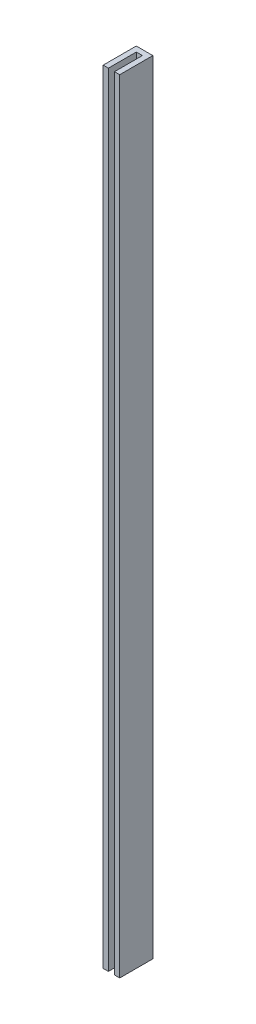
ISO-10303-21;
HEADER;
FILE_DESCRIPTION(('STEP AP214'),'2;1');
FILE_NAME('part.step','',(''),(''),'','','');
FILE_SCHEMA(('AUTOMOTIVE_DESIGN { 1 0 10303 214 1 1 1 1 }'));
ENDSEC;
DATA;
#1=APPLICATION_CONTEXT('core data for automotive mechanical design processes');
#2=APPLICATION_PROTOCOL_DEFINITION('international standard','automotive_design',2000,#1);
#3=PRODUCT_CONTEXT('',#1,'mechanical');
#4=PRODUCT('Part','Part','',(#3));
#5=PRODUCT_RELATED_PRODUCT_CATEGORY('part','',(#4));
#6=PRODUCT_DEFINITION_FORMATION('','',#4);
#7=PRODUCT_DEFINITION_CONTEXT('part definition',#1,'design');
#8=PRODUCT_DEFINITION('design','',#6,#7);
#9=PRODUCT_DEFINITION_SHAPE('','',#8);
#10=(LENGTH_UNIT() NAMED_UNIT(*) SI_UNIT(.MILLI.,.METRE.));
#11=(NAMED_UNIT(*) PLANE_ANGLE_UNIT() SI_UNIT($,.RADIAN.));
#12=(NAMED_UNIT(*) SI_UNIT($,.STERADIAN.) SOLID_ANGLE_UNIT());
#13=UNCERTAINTY_MEASURE_WITH_UNIT(LENGTH_MEASURE(1.E-05),#10,'distance_accuracy_value','');
#14=(GEOMETRIC_REPRESENTATION_CONTEXT(3) GLOBAL_UNCERTAINTY_ASSIGNED_CONTEXT((#13)) GLOBAL_UNIT_ASSIGNED_CONTEXT((#10,
#11,#12)) REPRESENTATION_CONTEXT('',''));
#15=CARTESIAN_POINT('',(0.,0.,0.));
#16=DIRECTION('',(0.,0.,1.));
#17=DIRECTION('',(1.,0.,0.));
#18=AXIS2_PLACEMENT_3D('',#15,#16,#17);
#19=CARTESIAN_POINT('',(-1.175,300.,12.7));
#20=DIRECTION('',(-1.,0.,0.));
#21=DIRECTION('',(0.,0.,1.));
#22=AXIS2_PLACEMENT_3D('',#19,#20,#21);
#23=PLANE('',#22);
#24=DIRECTION('',(0.,0.,-1.));
#25=VECTOR('',#24,1.);
#26=CARTESIAN_POINT('',(-1.175,0.,12.7));
#27=LINE('',#26,#25);
#28=CARTESIAN_POINT('',(-1.175,0.,12.7));
#29=VERTEX_POINT('',#28);
#30=CARTESIAN_POINT('',(-1.175,0.,2.));
#31=VERTEX_POINT('',#30);
#32=EDGE_CURVE('E129',#29,#31,#27,.T.);
#33=ORIENTED_EDGE('',*,*,#32,.T.);
#34=DIRECTION('',(0.,-1.,0.));
#35=VECTOR('',#34,1.);
#36=CARTESIAN_POINT('',(-1.175,300.,2.));
#37=LINE('',#36,#35);
#38=CARTESIAN_POINT('',(-1.175,300.,2.));
#39=VERTEX_POINT('',#38);
#40=EDGE_CURVE('E11',#39,#31,#37,.T.);
#41=ORIENTED_EDGE('',*,*,#40,.F.);
#42=DIRECTION('',(0.,0.,-1.));
#43=VECTOR('',#42,1.);
#44=CARTESIAN_POINT('',(-1.175,300.,12.7));
#45=LINE('',#44,#43);
#46=CARTESIAN_POINT('',(-1.175,300.,12.7));
#47=VERTEX_POINT('',#46);
#48=EDGE_CURVE('E143',#47,#39,#45,.T.);
#49=ORIENTED_EDGE('',*,*,#48,.F.);
#50=DIRECTION('',(0.,-1.,0.));
#51=VECTOR('',#50,1.);
#52=CARTESIAN_POINT('',(-1.175,300.,12.7));
#53=LINE('',#52,#51);
#54=EDGE_CURVE('E125',#47,#29,#53,.T.);
#55=ORIENTED_EDGE('',*,*,#54,.T.);
#56=EDGE_LOOP('',(#33,#41,#49,#55));
#57=FACE_BOUND('',#56,.T.);
#58=ADVANCED_FACE('F33',(#57),#23,.F.);
#59=CARTESIAN_POINT('',(-1.175,300.,2.));
#60=DIRECTION('',(0.,0.,-1.));
#61=DIRECTION('',(-1.,0.,0.));
#62=AXIS2_PLACEMENT_3D('',#59,#60,#61);
#63=PLANE('',#62);
#64=DIRECTION('',(1.,0.,0.));
#65=VECTOR('',#64,1.);
#66=CARTESIAN_POINT('',(-1.175,0.,2.));
#67=LINE('',#66,#65);
#68=CARTESIAN_POINT('',(1.175,0.,2.));
#69=VERTEX_POINT('',#68);
#70=EDGE_CURVE('E132',#31,#69,#67,.T.);
#71=ORIENTED_EDGE('',*,*,#70,.T.);
#72=DIRECTION('',(0.,-1.,0.));
#73=VECTOR('',#72,1.);
#74=CARTESIAN_POINT('',(1.175,300.,2.));
#75=LINE('',#74,#73);
#76=CARTESIAN_POINT('',(1.175,300.,2.));
#77=VERTEX_POINT('',#76);
#78=EDGE_CURVE('E41',#77,#69,#75,.T.);
#79=ORIENTED_EDGE('',*,*,#78,.F.);
#80=DIRECTION('',(1.,0.,0.));
#81=VECTOR('',#80,1.);
#82=CARTESIAN_POINT('',(-1.175,300.,2.));
#83=LINE('',#82,#81);
#84=EDGE_CURVE('E92',#39,#77,#83,.T.);
#85=ORIENTED_EDGE('',*,*,#84,.F.);
#86=ORIENTED_EDGE('',*,*,#40,.T.);
#87=EDGE_LOOP('',(#71,#79,#85,#86));
#88=FACE_BOUND('',#87,.T.);
#89=ADVANCED_FACE('F178',(#88),#63,.F.);
#90=CARTESIAN_POINT('',(1.175,300.,12.7));
#91=DIRECTION('',(1.,0.,0.));
#92=DIRECTION('',(0.,0.,-1.));
#93=AXIS2_PLACEMENT_3D('',#90,#91,#92);
#94=PLANE('',#93);
#95=DIRECTION('',(0.,0.,1.));
#96=VECTOR('',#95,1.);
#97=CARTESIAN_POINT('',(1.175,0.,12.7));
#98=LINE('',#97,#96);
#99=CARTESIAN_POINT('',(1.175,0.,12.7));
#100=VERTEX_POINT('',#99);
#101=EDGE_CURVE('E134',#69,#100,#98,.T.);
#102=ORIENTED_EDGE('',*,*,#101,.T.);
#103=DIRECTION('',(0.,-1.,0.));
#104=VECTOR('',#103,1.);
#105=CARTESIAN_POINT('',(1.175,300.,12.7));
#106=LINE('',#105,#104);
#107=CARTESIAN_POINT('',(1.175,300.,12.7));
#108=VERTEX_POINT('',#107);
#109=EDGE_CURVE('E150',#108,#100,#106,.T.);
#110=ORIENTED_EDGE('',*,*,#109,.F.);
#111=DIRECTION('',(0.,0.,1.));
#112=VECTOR('',#111,1.);
#113=CARTESIAN_POINT('',(1.175,300.,12.7));
#114=LINE('',#113,#112);
#115=EDGE_CURVE('E158',#77,#108,#114,.T.);
#116=ORIENTED_EDGE('',*,*,#115,.F.);
#117=ORIENTED_EDGE('',*,*,#78,.T.);
#118=EDGE_LOOP('',(#102,#110,#116,#117));
#119=FACE_BOUND('',#118,.T.);
#120=ADVANCED_FACE('F156',(#119),#94,.F.);
#121=CARTESIAN_POINT('',(3.175,300.,12.7));
#122=DIRECTION('',(0.,0.,-1.));
#123=DIRECTION('',(-1.,0.,0.));
#124=AXIS2_PLACEMENT_3D('',#121,#122,#123);
#125=PLANE('',#124);
#126=DIRECTION('',(1.,0.,0.));
#127=VECTOR('',#126,1.);
#128=CARTESIAN_POINT('',(3.175,0.,12.7));
#129=LINE('',#128,#127);
#130=CARTESIAN_POINT('',(3.175,0.,12.7));
#131=VERTEX_POINT('',#130);
#132=EDGE_CURVE('E136',#100,#131,#129,.T.);
#133=ORIENTED_EDGE('',*,*,#132,.T.);
#134=DIRECTION('',(0.,-1.,0.));
#135=VECTOR('',#134,1.);
#136=CARTESIAN_POINT('',(3.175,300.,12.7));
#137=LINE('',#136,#135);
#138=CARTESIAN_POINT('',(3.175,300.,12.7));
#139=VERTEX_POINT('',#138);
#140=EDGE_CURVE('E147',#139,#131,#137,.T.);
#141=ORIENTED_EDGE('',*,*,#140,.F.);
#142=DIRECTION('',(1.,0.,0.));
#143=VECTOR('',#142,1.);
#144=CARTESIAN_POINT('',(3.175,300.,12.7));
#145=LINE('',#144,#143);
#146=EDGE_CURVE('E170',#108,#139,#145,.T.);
#147=ORIENTED_EDGE('',*,*,#146,.F.);
#148=ORIENTED_EDGE('',*,*,#109,.T.);
#149=EDGE_LOOP('',(#133,#141,#147,#148));
#150=FACE_BOUND('',#149,.T.);
#151=ADVANCED_FACE('F166',(#150),#125,.F.);
#152=CARTESIAN_POINT('',(3.175,300.,0.));
#153=DIRECTION('',(-1.,0.,0.));
#154=DIRECTION('',(0.,0.,1.));
#155=AXIS2_PLACEMENT_3D('',#152,#153,#154);
#156=PLANE('',#155);
#157=DIRECTION('',(0.,0.,-1.));
#158=VECTOR('',#157,1.);
#159=CARTESIAN_POINT('',(3.175,0.,0.));
#160=LINE('',#159,#158);
#161=CARTESIAN_POINT('',(3.175,0.,0.));
#162=VERTEX_POINT('',#161);
#163=EDGE_CURVE('E138',#131,#162,#160,.T.);
#164=ORIENTED_EDGE('',*,*,#163,.T.);
#165=DIRECTION('',(0.,-1.,0.));
#166=VECTOR('',#165,1.);
#167=CARTESIAN_POINT('',(3.175,300.,0.));
#168=LINE('',#167,#166);
#169=CARTESIAN_POINT('',(3.175,300.,0.));
#170=VERTEX_POINT('',#169);
#171=EDGE_CURVE('E120',#170,#162,#168,.T.);
#172=ORIENTED_EDGE('',*,*,#171,.F.);
#173=DIRECTION('',(0.,0.,-1.));
#174=VECTOR('',#173,1.);
#175=CARTESIAN_POINT('',(3.175,300.,0.));
#176=LINE('',#175,#174);
#177=EDGE_CURVE('E111',#139,#170,#176,.T.);
#178=ORIENTED_EDGE('',*,*,#177,.F.);
#179=ORIENTED_EDGE('',*,*,#140,.T.);
#180=EDGE_LOOP('',(#164,#172,#178,#179));
#181=FACE_BOUND('',#180,.T.);
#182=ADVANCED_FACE('F169',(#181),#156,.F.);
#183=CARTESIAN_POINT('',(3.175,300.,0.));
#184=DIRECTION('',(0.,0.,1.));
#185=DIRECTION('',(1.,0.,0.));
#186=AXIS2_PLACEMENT_3D('',#183,#184,#185);
#187=PLANE('',#186);
#188=DIRECTION('',(-1.,0.,0.));
#189=VECTOR('',#188,1.);
#190=CARTESIAN_POINT('',(3.175,0.,0.));
#191=LINE('',#190,#189);
#192=CARTESIAN_POINT('',(-3.175,0.,0.));
#193=VERTEX_POINT('',#192);
#194=EDGE_CURVE('E119',#162,#193,#191,.T.);
#195=ORIENTED_EDGE('',*,*,#194,.T.);
#196=DIRECTION('',(0.,-1.,0.));
#197=VECTOR('',#196,1.);
#198=CARTESIAN_POINT('',(-3.175,300.,0.));
#199=LINE('',#198,#197);
#200=CARTESIAN_POINT('',(-3.175,300.,0.));
#201=VERTEX_POINT('',#200);
#202=EDGE_CURVE('E116',#201,#193,#199,.T.);
#203=ORIENTED_EDGE('',*,*,#202,.F.);
#204=DIRECTION('',(-1.,0.,0.));
#205=VECTOR('',#204,1.);
#206=CARTESIAN_POINT('',(3.175,300.,0.));
#207=LINE('',#206,#205);
#208=EDGE_CURVE('E105',#170,#201,#207,.T.);
#209=ORIENTED_EDGE('',*,*,#208,.F.);
#210=ORIENTED_EDGE('',*,*,#171,.T.);
#211=EDGE_LOOP('',(#195,#203,#209,#210));
#212=FACE_BOUND('',#211,.T.);
#213=ADVANCED_FACE('F117',(#212),#187,.F.);
#214=CARTESIAN_POINT('',(-3.175,300.,0.));
#215=DIRECTION('',(1.,0.,0.));
#216=DIRECTION('',(0.,0.,-1.));
#217=AXIS2_PLACEMENT_3D('',#214,#215,#216);
#218=PLANE('',#217);
#219=DIRECTION('',(0.,0.,1.));
#220=VECTOR('',#219,1.);
#221=CARTESIAN_POINT('',(-3.175,0.,0.));
#222=LINE('',#221,#220);
#223=CARTESIAN_POINT('',(-3.175,0.,12.7));
#224=VERTEX_POINT('',#223);
#225=EDGE_CURVE('E78',#193,#224,#222,.T.);
#226=ORIENTED_EDGE('',*,*,#225,.T.);
#227=DIRECTION('',(0.,-1.,0.));
#228=VECTOR('',#227,1.);
#229=CARTESIAN_POINT('',(-3.175,300.,12.7));
#230=LINE('',#229,#228);
#231=CARTESIAN_POINT('',(-3.175,300.,12.7));
#232=VERTEX_POINT('',#231);
#233=EDGE_CURVE('E121',#232,#224,#230,.T.);
#234=ORIENTED_EDGE('',*,*,#233,.F.);
#235=DIRECTION('',(0.,0.,1.));
#236=VECTOR('',#235,1.);
#237=CARTESIAN_POINT('',(-3.175,300.,0.));
#238=LINE('',#237,#236);
#239=EDGE_CURVE('E109',#201,#232,#238,.T.);
#240=ORIENTED_EDGE('',*,*,#239,.F.);
#241=ORIENTED_EDGE('',*,*,#202,.T.);
#242=EDGE_LOOP('',(#226,#234,#240,#241));
#243=FACE_BOUND('',#242,.T.);
#244=ADVANCED_FACE('F123',(#243),#218,.F.);
#245=CARTESIAN_POINT('',(-3.175,300.,12.7));
#246=DIRECTION('',(0.,0.,-1.));
#247=DIRECTION('',(-1.,0.,0.));
#248=AXIS2_PLACEMENT_3D('',#245,#246,#247);
#249=PLANE('',#248);
#250=DIRECTION('',(1.,0.,0.));
#251=VECTOR('',#250,1.);
#252=CARTESIAN_POINT('',(-3.175,0.,12.7));
#253=LINE('',#252,#251);
#254=EDGE_CURVE('E84',#224,#29,#253,.T.);
#255=ORIENTED_EDGE('',*,*,#254,.T.);
#256=ORIENTED_EDGE('',*,*,#54,.F.);
#257=DIRECTION('',(1.,0.,0.));
#258=VECTOR('',#257,1.);
#259=CARTESIAN_POINT('',(-3.175,300.,12.7));
#260=LINE('',#259,#258);
#261=EDGE_CURVE('E49',#232,#47,#260,.T.);
#262=ORIENTED_EDGE('',*,*,#261,.F.);
#263=ORIENTED_EDGE('',*,*,#233,.T.);
#264=EDGE_LOOP('',(#255,#256,#262,#263));
#265=FACE_BOUND('',#264,.T.);
#266=ADVANCED_FACE('F194',(#265),#249,.F.);
#267=CARTESIAN_POINT('',(0.,300.,0.));
#268=DIRECTION('',(0.,-1.,0.));
#269=DIRECTION('',(0.,0.,-1.));
#270=AXIS2_PLACEMENT_3D('',#267,#268,#269);
#271=PLANE('',#270);
#272=ORIENTED_EDGE('',*,*,#48,.T.);
#273=ORIENTED_EDGE('',*,*,#84,.T.);
#274=ORIENTED_EDGE('',*,*,#115,.T.);
#275=ORIENTED_EDGE('',*,*,#146,.T.);
#276=ORIENTED_EDGE('',*,*,#177,.T.);
#277=ORIENTED_EDGE('',*,*,#208,.T.);
#278=ORIENTED_EDGE('',*,*,#239,.T.);
#279=ORIENTED_EDGE('',*,*,#261,.T.);
#280=EDGE_LOOP('',(#272,#273,#274,#275,#276,#277,#278,#279));
#281=FACE_BOUND('',#280,.T.);
#282=ADVANCED_FACE('F107',(#281),#271,.F.);
#283=CARTESIAN_POINT('',(0.,0.,0.));
#284=DIRECTION('',(0.,-1.,0.));
#285=DIRECTION('',(0.,0.,-1.));
#286=AXIS2_PLACEMENT_3D('',#283,#284,#285);
#287=PLANE('',#286);
#288=ORIENTED_EDGE('',*,*,#32,.F.);
#289=ORIENTED_EDGE('',*,*,#254,.F.);
#290=ORIENTED_EDGE('',*,*,#225,.F.);
#291=ORIENTED_EDGE('',*,*,#194,.F.);
#292=ORIENTED_EDGE('',*,*,#163,.F.);
#293=ORIENTED_EDGE('',*,*,#132,.F.);
#294=ORIENTED_EDGE('',*,*,#101,.F.);
#295=ORIENTED_EDGE('',*,*,#70,.F.);
#296=EDGE_LOOP('',(#288,#289,#290,#291,#292,#293,#294,#295));
#297=FACE_BOUND('',#296,.T.);
#298=ADVANCED_FACE('F162',(#297),#287,.T.);
#299=CLOSED_SHELL('',(#58,#89,#120,#151,#182,#213,#244,#266,#282,#298));
#300=MANIFOLD_SOLID_BREP('B2',#299);
#301=ADVANCED_BREP_SHAPE_REPRESENTATION('',(#18,#300),#14);
#302=SHAPE_DEFINITION_REPRESENTATION(#9,#301);
ENDSEC;
END-ISO-10303-21;
